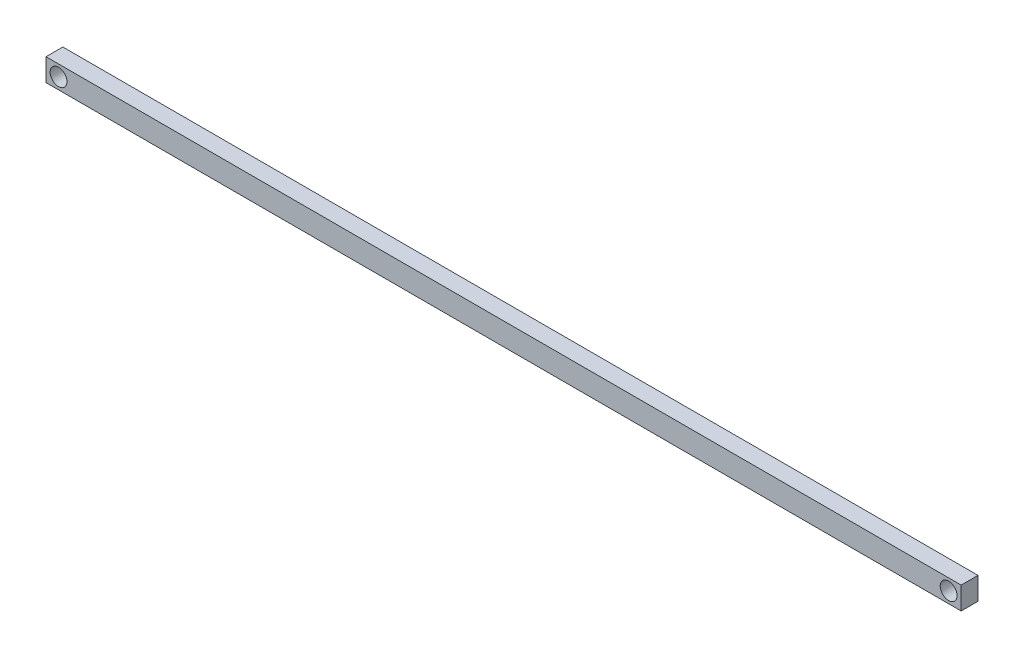
ISO-10303-21;
HEADER;
FILE_DESCRIPTION(('STEP AP214'),'2;1');
FILE_NAME('part.step','',(''),(''),'','','');
FILE_SCHEMA(('AUTOMOTIVE_DESIGN { 1 0 10303 214 1 1 1 1 }'));
ENDSEC;
DATA;
#1=APPLICATION_CONTEXT('core data for automotive mechanical design processes');
#2=APPLICATION_PROTOCOL_DEFINITION('international standard','automotive_design',2000,#1);
#3=PRODUCT_CONTEXT('',#1,'mechanical');
#4=PRODUCT('Part','Part','',(#3));
#5=PRODUCT_RELATED_PRODUCT_CATEGORY('part','',(#4));
#6=PRODUCT_DEFINITION_FORMATION('','',#4);
#7=PRODUCT_DEFINITION_CONTEXT('part definition',#1,'design');
#8=PRODUCT_DEFINITION('design','',#6,#7);
#9=PRODUCT_DEFINITION_SHAPE('','',#8);
#10=(LENGTH_UNIT() NAMED_UNIT(*) SI_UNIT(.MILLI.,.METRE.));
#11=(NAMED_UNIT(*) PLANE_ANGLE_UNIT() SI_UNIT($,.RADIAN.));
#12=(NAMED_UNIT(*) SI_UNIT($,.STERADIAN.) SOLID_ANGLE_UNIT());
#13=UNCERTAINTY_MEASURE_WITH_UNIT(LENGTH_MEASURE(1.E-05),#10,'distance_accuracy_value','');
#14=(GEOMETRIC_REPRESENTATION_CONTEXT(3) GLOBAL_UNCERTAINTY_ASSIGNED_CONTEXT((#13)) GLOBAL_UNIT_ASSIGNED_CONTEXT((#10,
#11,#12)) REPRESENTATION_CONTEXT('',''));
#15=CARTESIAN_POINT('',(0.,0.,0.));
#16=DIRECTION('',(0.,0.,1.));
#17=DIRECTION('',(1.,0.,0.));
#18=AXIS2_PLACEMENT_3D('',#15,#16,#17);
#19=CARTESIAN_POINT('',(0.,0.,15.));
#20=DIRECTION('',(0.,0.,1.));
#21=DIRECTION('',(1.,0.,0.));
#22=AXIS2_PLACEMENT_3D('',#19,#20,#21);
#23=PLANE('',#22);
#24=CARTESIAN_POINT('',(-396.345,0.,15.));
#25=DIRECTION('',(0.,0.,1.));
#26=DIRECTION('',(1.,0.,0.));
#27=AXIS2_PLACEMENT_3D('',#24,#25,#26);
#28=CIRCLE('',#27,7.50000000000001);
#29=CARTESIAN_POINT('',(-388.845,0.,15.));
#30=VERTEX_POINT('',#29);
#31=EDGE_CURVE('E112',#30,#30,#28,.T.);
#32=ORIENTED_EDGE('',*,*,#31,.F.);
#33=EDGE_LOOP('',(#32));
#34=FACE_BOUND('',#33,.T.);
#35=DIRECTION('',(0.,1.,0.));
#36=VECTOR('',#35,1.);
#37=CARTESIAN_POINT('',(407.5,10.,15.));
#38=LINE('',#37,#36);
#39=CARTESIAN_POINT('',(407.5,-10.,15.));
#40=VERTEX_POINT('',#39);
#41=CARTESIAN_POINT('',(407.5,10.,15.));
#42=VERTEX_POINT('',#41);
#43=EDGE_CURVE('E92',#40,#42,#38,.T.);
#44=ORIENTED_EDGE('',*,*,#43,.T.);
#45=DIRECTION('',(-1.,0.,0.));
#46=VECTOR('',#45,1.);
#47=CARTESIAN_POINT('',(-407.5,10.,15.));
#48=LINE('',#47,#46);
#49=CARTESIAN_POINT('',(-407.5,10.,15.));
#50=VERTEX_POINT('',#49);
#51=EDGE_CURVE('E87',#42,#50,#48,.T.);
#52=ORIENTED_EDGE('',*,*,#51,.T.);
#53=DIRECTION('',(0.,-1.,0.));
#54=VECTOR('',#53,1.);
#55=CARTESIAN_POINT('',(-407.5,10.,15.));
#56=LINE('',#55,#54);
#57=CARTESIAN_POINT('',(-407.5,-10.,15.));
#58=VERTEX_POINT('',#57);
#59=EDGE_CURVE('E90',#50,#58,#56,.T.);
#60=ORIENTED_EDGE('',*,*,#59,.T.);
#61=DIRECTION('',(1.,0.,0.));
#62=VECTOR('',#61,1.);
#63=CARTESIAN_POINT('',(-407.5,-10.,15.));
#64=LINE('',#63,#62);
#65=EDGE_CURVE('E57',#58,#40,#64,.T.);
#66=ORIENTED_EDGE('',*,*,#65,.T.);
#67=EDGE_LOOP('',(#44,#52,#60,#66));
#68=FACE_BOUND('',#67,.T.);
#69=CARTESIAN_POINT('',(396.345,0.,15.));
#70=DIRECTION('',(0.,0.,1.));
#71=DIRECTION('',(1.,0.,0.));
#72=AXIS2_PLACEMENT_3D('',#69,#70,#71);
#73=CIRCLE('',#72,7.50000000000001);
#74=CARTESIAN_POINT('',(403.845,0.,15.));
#75=VERTEX_POINT('',#74);
#76=EDGE_CURVE('E134',#75,#75,#73,.T.);
#77=ORIENTED_EDGE('',*,*,#76,.F.);
#78=EDGE_LOOP('',(#77));
#79=FACE_BOUND('',#78,.T.);
#80=ADVANCED_FACE('F39',(#34,#68,#79),#23,.T.);
#81=CARTESIAN_POINT('',(0.,0.,0.));
#82=DIRECTION('',(0.,0.,1.));
#83=DIRECTION('',(1.,0.,0.));
#84=AXIS2_PLACEMENT_3D('',#81,#82,#83);
#85=PLANE('',#84);
#86=DIRECTION('',(0.,1.,0.));
#87=VECTOR('',#86,1.);
#88=CARTESIAN_POINT('',(407.5,10.,0.));
#89=LINE('',#88,#87);
#90=CARTESIAN_POINT('',(407.5,-10.,0.));
#91=VERTEX_POINT('',#90);
#92=CARTESIAN_POINT('',(407.5,10.,0.));
#93=VERTEX_POINT('',#92);
#94=EDGE_CURVE('E108',#91,#93,#89,.T.);
#95=ORIENTED_EDGE('',*,*,#94,.F.);
#96=DIRECTION('',(1.,0.,0.));
#97=VECTOR('',#96,1.);
#98=CARTESIAN_POINT('',(-407.5,-10.,0.));
#99=LINE('',#98,#97);
#100=CARTESIAN_POINT('',(-407.5,-10.,0.));
#101=VERTEX_POINT('',#100);
#102=EDGE_CURVE('E80',#101,#91,#99,.T.);
#103=ORIENTED_EDGE('',*,*,#102,.F.);
#104=DIRECTION('',(0.,-1.,0.));
#105=VECTOR('',#104,1.);
#106=CARTESIAN_POINT('',(-407.5,10.,0.));
#107=LINE('',#106,#105);
#108=CARTESIAN_POINT('',(-407.5,10.,0.));
#109=VERTEX_POINT('',#108);
#110=EDGE_CURVE('E74',#109,#101,#107,.T.);
#111=ORIENTED_EDGE('',*,*,#110,.F.);
#112=DIRECTION('',(-1.,0.,0.));
#113=VECTOR('',#112,1.);
#114=CARTESIAN_POINT('',(-407.5,10.,0.));
#115=LINE('',#114,#113);
#116=EDGE_CURVE('E97',#93,#109,#115,.T.);
#117=ORIENTED_EDGE('',*,*,#116,.F.);
#118=EDGE_LOOP('',(#95,#103,#111,#117));
#119=FACE_BOUND('',#118,.T.);
#120=CARTESIAN_POINT('',(-396.345,0.,0.));
#121=DIRECTION('',(0.,0.,1.));
#122=DIRECTION('',(1.,0.,0.));
#123=AXIS2_PLACEMENT_3D('',#120,#121,#122);
#124=CIRCLE('',#123,7.50000000000001);
#125=CARTESIAN_POINT('',(-388.845,0.,0.));
#126=VERTEX_POINT('',#125);
#127=EDGE_CURVE('E130',#126,#126,#124,.T.);
#128=ORIENTED_EDGE('',*,*,#127,.T.);
#129=EDGE_LOOP('',(#128));
#130=FACE_BOUND('',#129,.T.);
#131=CARTESIAN_POINT('',(396.345,0.,0.));
#132=DIRECTION('',(0.,0.,1.));
#133=DIRECTION('',(1.,0.,0.));
#134=AXIS2_PLACEMENT_3D('',#131,#132,#133);
#135=CIRCLE('',#134,7.50000000000001);
#136=CARTESIAN_POINT('',(403.845,0.,0.));
#137=VERTEX_POINT('',#136);
#138=EDGE_CURVE('E138',#137,#137,#135,.T.);
#139=ORIENTED_EDGE('',*,*,#138,.T.);
#140=EDGE_LOOP('',(#139));
#141=FACE_BOUND('',#140,.T.);
#142=ADVANCED_FACE('F125',(#119,#130,#141),#85,.F.);
#143=CARTESIAN_POINT('',(407.5,10.,15.));
#144=DIRECTION('',(-1.,0.,0.));
#145=DIRECTION('',(0.,0.,1.));
#146=AXIS2_PLACEMENT_3D('',#143,#144,#145);
#147=PLANE('',#146);
#148=ORIENTED_EDGE('',*,*,#94,.T.);
#149=DIRECTION('',(0.,0.,-1.));
#150=VECTOR('',#149,1.);
#151=CARTESIAN_POINT('',(407.5,10.,15.));
#152=LINE('',#151,#150);
#153=EDGE_CURVE('E11',#42,#93,#152,.T.);
#154=ORIENTED_EDGE('',*,*,#153,.F.);
#155=ORIENTED_EDGE('',*,*,#43,.F.);
#156=DIRECTION('',(0.,0.,-1.));
#157=VECTOR('',#156,1.);
#158=CARTESIAN_POINT('',(407.5,-10.,15.));
#159=LINE('',#158,#157);
#160=EDGE_CURVE('E104',#40,#91,#159,.T.);
#161=ORIENTED_EDGE('',*,*,#160,.T.);
#162=EDGE_LOOP('',(#148,#154,#155,#161));
#163=FACE_BOUND('',#162,.T.);
#164=ADVANCED_FACE('F41',(#163),#147,.F.);
#165=CARTESIAN_POINT('',(-407.5,10.,15.));
#166=DIRECTION('',(0.,-1.,0.));
#167=DIRECTION('',(0.,0.,-1.));
#168=AXIS2_PLACEMENT_3D('',#165,#166,#167);
#169=PLANE('',#168);
#170=ORIENTED_EDGE('',*,*,#116,.T.);
#171=DIRECTION('',(0.,0.,-1.));
#172=VECTOR('',#171,1.);
#173=CARTESIAN_POINT('',(-407.5,10.,15.));
#174=LINE('',#173,#172);
#175=EDGE_CURVE('E49',#50,#109,#174,.T.);
#176=ORIENTED_EDGE('',*,*,#175,.F.);
#177=ORIENTED_EDGE('',*,*,#51,.F.);
#178=ORIENTED_EDGE('',*,*,#153,.T.);
#179=EDGE_LOOP('',(#170,#176,#177,#178));
#180=FACE_BOUND('',#179,.T.);
#181=ADVANCED_FACE('F96',(#180),#169,.F.);
#182=CARTESIAN_POINT('',(-407.5,10.,15.));
#183=DIRECTION('',(1.,0.,0.));
#184=DIRECTION('',(0.,0.,-1.));
#185=AXIS2_PLACEMENT_3D('',#182,#183,#184);
#186=PLANE('',#185);
#187=ORIENTED_EDGE('',*,*,#110,.T.);
#188=DIRECTION('',(0.,0.,-1.));
#189=VECTOR('',#188,1.);
#190=CARTESIAN_POINT('',(-407.5,-10.,15.));
#191=LINE('',#190,#189);
#192=EDGE_CURVE('E99',#58,#101,#191,.T.);
#193=ORIENTED_EDGE('',*,*,#192,.F.);
#194=ORIENTED_EDGE('',*,*,#59,.F.);
#195=ORIENTED_EDGE('',*,*,#175,.T.);
#196=EDGE_LOOP('',(#187,#193,#194,#195));
#197=FACE_BOUND('',#196,.T.);
#198=ADVANCED_FACE('F100',(#197),#186,.F.);
#199=CARTESIAN_POINT('',(-407.5,-10.,15.));
#200=DIRECTION('',(0.,1.,0.));
#201=DIRECTION('',(0.,0.,1.));
#202=AXIS2_PLACEMENT_3D('',#199,#200,#201);
#203=PLANE('',#202);
#204=ORIENTED_EDGE('',*,*,#102,.T.);
#205=ORIENTED_EDGE('',*,*,#160,.F.);
#206=ORIENTED_EDGE('',*,*,#65,.F.);
#207=ORIENTED_EDGE('',*,*,#192,.T.);
#208=EDGE_LOOP('',(#204,#205,#206,#207));
#209=FACE_BOUND('',#208,.T.);
#210=ADVANCED_FACE('F122',(#209),#203,.F.);
#211=CARTESIAN_POINT('',(-396.345,0.,15.));
#212=DIRECTION('',(0.,0.,-1.));
#213=DIRECTION('',(-1.,0.,0.));
#214=AXIS2_PLACEMENT_3D('',#211,#212,#213);
#215=CYLINDRICAL_SURFACE('',#214,7.50000000000001);
#216=ORIENTED_EDGE('',*,*,#31,.T.);
#217=EDGE_LOOP('',(#216));
#218=FACE_BOUND('',#217,.T.);
#219=ORIENTED_EDGE('',*,*,#127,.F.);
#220=EDGE_LOOP('',(#219));
#221=FACE_BOUND('',#220,.T.);
#222=ADVANCED_FACE('F157',(#218,#221),#215,.F.);
#223=CARTESIAN_POINT('',(396.345,0.,15.));
#224=DIRECTION('',(0.,0.,-1.));
#225=DIRECTION('',(-1.,0.,0.));
#226=AXIS2_PLACEMENT_3D('',#223,#224,#225);
#227=CYLINDRICAL_SURFACE('',#226,7.50000000000001);
#228=ORIENTED_EDGE('',*,*,#76,.T.);
#229=EDGE_LOOP('',(#228));
#230=FACE_BOUND('',#229,.T.);
#231=ORIENTED_EDGE('',*,*,#138,.F.);
#232=EDGE_LOOP('',(#231));
#233=FACE_BOUND('',#232,.T.);
#234=ADVANCED_FACE('F146',(#230,#233),#227,.F.);
#235=CLOSED_SHELL('',(#80,#142,#164,#181,#198,#210,#222,#234));
#236=MANIFOLD_SOLID_BREP('B2',#235);
#237=ADVANCED_BREP_SHAPE_REPRESENTATION('',(#18,#236),#14);
#238=SHAPE_DEFINITION_REPRESENTATION(#9,#237);
ENDSEC;
END-ISO-10303-21;
